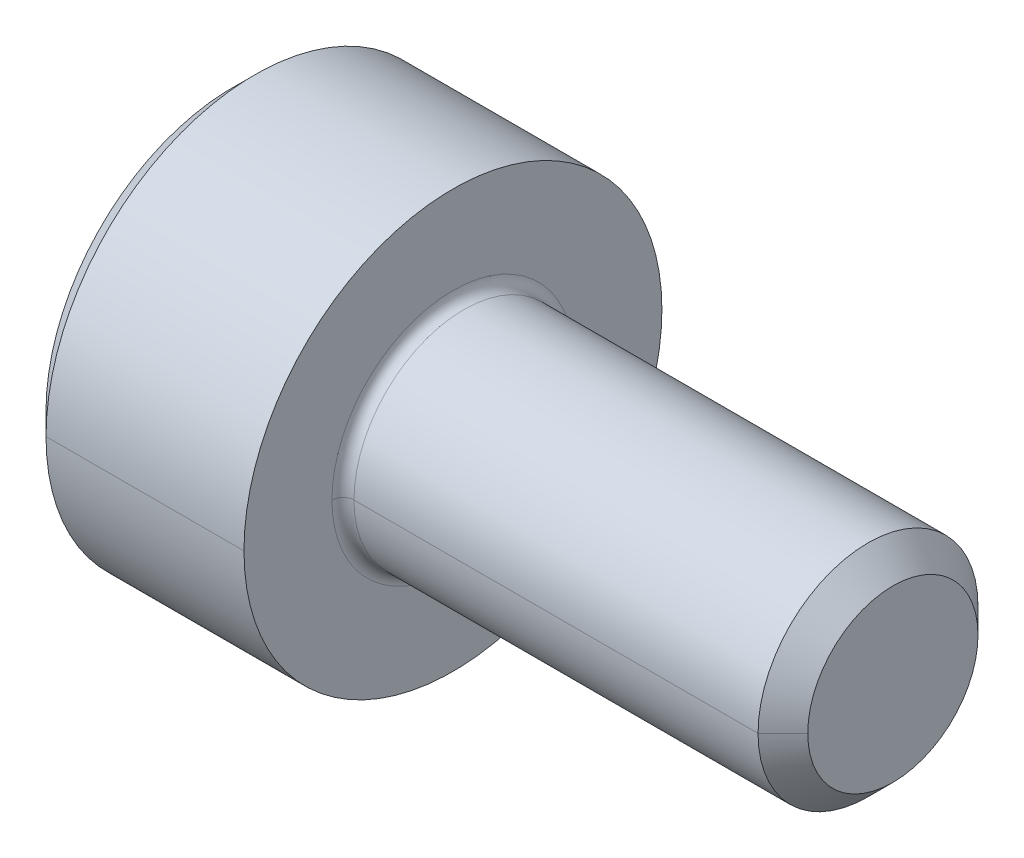
ISO-10303-21;
HEADER;
FILE_DESCRIPTION(('STEP AP214'),'2;1');
FILE_NAME('part.step','',(''),(''),'','','');
FILE_SCHEMA(('AUTOMOTIVE_DESIGN { 1 0 10303 214 1 1 1 1 }'));
ENDSEC;
DATA;
#1=APPLICATION_CONTEXT('core data for automotive mechanical design processes');
#2=APPLICATION_PROTOCOL_DEFINITION('international standard','automotive_design',2000,#1);
#3=PRODUCT_CONTEXT('',#1,'mechanical');
#4=PRODUCT('Part','Part','',(#3));
#5=PRODUCT_RELATED_PRODUCT_CATEGORY('part','',(#4));
#6=PRODUCT_DEFINITION_FORMATION('','',#4);
#7=PRODUCT_DEFINITION_CONTEXT('part definition',#1,'design');
#8=PRODUCT_DEFINITION('design','',#6,#7);
#9=PRODUCT_DEFINITION_SHAPE('','',#8);
#10=(LENGTH_UNIT() NAMED_UNIT(*) SI_UNIT(.MILLI.,.METRE.));
#11=(NAMED_UNIT(*) PLANE_ANGLE_UNIT() SI_UNIT($,.RADIAN.));
#12=(NAMED_UNIT(*) SI_UNIT($,.STERADIAN.) SOLID_ANGLE_UNIT());
#13=UNCERTAINTY_MEASURE_WITH_UNIT(LENGTH_MEASURE(1.E-05),#10,'distance_accuracy_value','');
#14=(GEOMETRIC_REPRESENTATION_CONTEXT(3) GLOBAL_UNCERTAINTY_ASSIGNED_CONTEXT((#13)) GLOBAL_UNIT_ASSIGNED_CONTEXT((#10,
#11,#12)) REPRESENTATION_CONTEXT('',''));
#15=CARTESIAN_POINT('',(0.,0.,0.));
#16=DIRECTION('',(0.,0.,1.));
#17=DIRECTION('',(1.,0.,0.));
#18=AXIS2_PLACEMENT_3D('',#15,#16,#17);
#19=CARTESIAN_POINT('',(1.,0.,0.));
#20=DIRECTION('',(-1.,0.,0.));
#21=DIRECTION('',(0.,0.,1.));
#22=AXIS2_PLACEMENT_3D('',#19,#20,#21);
#23=CONICAL_SURFACE('',#22,0.7725,1.04719755119659);
#24=DIRECTION('',(-0.500000000000007,0.,-0.866025403784435));
#25=VECTOR('',#24,1.);
#26=CARTESIAN_POINT('',(1.,0.,-0.7725));
#27=LINE('',#26,#25);
#28=CARTESIAN_POINT('',(1.446003082949,0.,0.));
#29=VERTEX_POINT('',#28);
#30=CARTESIAN_POINT('',(1.,0.,-0.7725));
#31=VERTEX_POINT('',#30);
#32=EDGE_CURVE('E162',#29,#31,#27,.T.);
#33=ORIENTED_EDGE('',*,*,#32,.F.);
#34=DIRECTION('',(-0.500000000000007,0.,0.866025403784435));
#35=VECTOR('',#34,1.);
#36=CARTESIAN_POINT('',(1.,0.,0.7725));
#37=LINE('',#36,#35);
#38=CARTESIAN_POINT('',(1.,0.,0.7725));
#39=VERTEX_POINT('',#38);
#40=EDGE_CURVE('E158',#29,#39,#37,.T.);
#41=ORIENTED_EDGE('',*,*,#40,.T.);
#42=CARTESIAN_POINT('',(1.,0.,0.));
#43=DIRECTION('',(-1.,0.,0.));
#44=DIRECTION('',(0.,0.,1.));
#45=AXIS2_PLACEMENT_3D('',#42,#43,#44);
#46=CIRCLE('',#45,0.7725);
#47=CARTESIAN_POINT('',(1.,0.669004624423476,0.38625));
#48=VERTEX_POINT('',#47);
#49=EDGE_CURVE('E253',#39,#48,#46,.T.);
#50=ORIENTED_EDGE('',*,*,#49,.T.);
#51=CARTESIAN_POINT('',(1.,0.,0.));
#52=DIRECTION('',(-1.,0.,0.));
#53=DIRECTION('',(0.,0.,1.));
#54=AXIS2_PLACEMENT_3D('',#51,#52,#53);
#55=CIRCLE('',#54,0.7725);
#56=CARTESIAN_POINT('',(1.,0.669004624423477,-0.38625));
#57=VERTEX_POINT('',#56);
#58=EDGE_CURVE('E28',#48,#57,#55,.T.);
#59=ORIENTED_EDGE('',*,*,#58,.T.);
#60=CARTESIAN_POINT('',(1.,0.,0.));
#61=DIRECTION('',(-1.,0.,0.));
#62=DIRECTION('',(0.,0.,1.));
#63=AXIS2_PLACEMENT_3D('',#60,#61,#62);
#64=CIRCLE('',#63,0.7725);
#65=EDGE_CURVE('E11',#57,#31,#64,.T.);
#66=ORIENTED_EDGE('',*,*,#65,.T.);
#67=EDGE_LOOP('',(#33,#41,#50,#59,#66));
#68=FACE_BOUND('',#67,.T.);
#69=ADVANCED_FACE('F17',(#68),#23,.F.);
#70=CARTESIAN_POINT('',(1.,1.33800924884695,-0.7725));
#71=DIRECTION('',(1.,0.,0.));
#72=DIRECTION('',(0.,1.,0.));
#73=AXIS2_PLACEMENT_3D('',#70,#71,#72);
#74=PLANE('',#73);
#75=DIRECTION('',(0.,-0.5,-0.866025403784438));
#76=VECTOR('',#75,1.);
#77=CARTESIAN_POINT('',(1.,0.892006165897968,0.));
#78=LINE('',#77,#76);
#79=CARTESIAN_POINT('',(1.,0.446003082948981,-0.7725));
#80=VERTEX_POINT('',#79);
#81=EDGE_CURVE('E21',#57,#80,#78,.T.);
#82=ORIENTED_EDGE('',*,*,#81,.T.);
#83=DIRECTION('',(0.,-1.,0.));
#84=VECTOR('',#83,1.);
#85=CARTESIAN_POINT('',(1.,0.446003082948981,-0.7725));
#86=LINE('',#85,#84);
#87=EDGE_CURVE('E121',#80,#31,#86,.T.);
#88=ORIENTED_EDGE('',*,*,#87,.T.);
#89=ORIENTED_EDGE('',*,*,#65,.F.);
#90=EDGE_LOOP('',(#82,#88,#89));
#91=FACE_BOUND('',#90,.T.);
#92=ADVANCED_FACE('F556',(#91),#74,.F.);
#93=CARTESIAN_POINT('',(1.,1.33800924884695,-0.7725));
#94=DIRECTION('',(1.,0.,0.));
#95=DIRECTION('',(0.,1.,0.));
#96=AXIS2_PLACEMENT_3D('',#93,#94,#95);
#97=PLANE('',#96);
#98=DIRECTION('',(0.,-0.5,0.86602540378444));
#99=VECTOR('',#98,1.);
#100=CARTESIAN_POINT('',(1.,0.892006165897968,0.));
#101=LINE('',#100,#99);
#102=CARTESIAN_POINT('',(1.,0.892006165897968,0.));
#103=VERTEX_POINT('',#102);
#104=EDGE_CURVE('E217',#103,#48,#101,.T.);
#105=ORIENTED_EDGE('',*,*,#104,.F.);
#106=DIRECTION('',(0.,-0.5,-0.866025403784438));
#107=VECTOR('',#106,1.);
#108=CARTESIAN_POINT('',(1.,0.892006165897968,0.));
#109=LINE('',#108,#107);
#110=EDGE_CURVE('E249',#103,#57,#109,.T.);
#111=ORIENTED_EDGE('',*,*,#110,.T.);
#112=ORIENTED_EDGE('',*,*,#58,.F.);
#113=EDGE_LOOP('',(#105,#111,#112));
#114=FACE_BOUND('',#113,.T.);
#115=ADVANCED_FACE('F750',(#114),#97,.F.);
#116=CARTESIAN_POINT('',(1.,1.33800924884695,-0.7725));
#117=DIRECTION('',(1.,0.,0.));
#118=DIRECTION('',(0.,1.,0.));
#119=AXIS2_PLACEMENT_3D('',#116,#117,#118);
#120=PLANE('',#119);
#121=DIRECTION('',(0.,1.,0.));
#122=VECTOR('',#121,1.);
#123=CARTESIAN_POINT('',(1.,-0.446003082948988,0.7725));
#124=LINE('',#123,#122);
#125=CARTESIAN_POINT('',(1.,0.446003082948983,0.7725));
#126=VERTEX_POINT('',#125);
#127=EDGE_CURVE('E156',#39,#126,#124,.T.);
#128=ORIENTED_EDGE('',*,*,#127,.T.);
#129=DIRECTION('',(0.,-0.5,0.86602540378444));
#130=VECTOR('',#129,1.);
#131=CARTESIAN_POINT('',(1.,0.892006165897968,0.));
#132=LINE('',#131,#130);
#133=EDGE_CURVE('E157',#48,#126,#132,.T.);
#134=ORIENTED_EDGE('',*,*,#133,.F.);
#135=ORIENTED_EDGE('',*,*,#49,.F.);
#136=EDGE_LOOP('',(#128,#134,#135));
#137=FACE_BOUND('',#136,.T.);
#138=ADVANCED_FACE('F739',(#137),#120,.F.);
#139=CARTESIAN_POINT('',(1.,1.33800924884695,-0.7725));
#140=DIRECTION('',(1.,0.,0.));
#141=DIRECTION('',(0.,1.,0.));
#142=AXIS2_PLACEMENT_3D('',#139,#140,#141);
#143=PLANE('',#142);
#144=DIRECTION('',(0.,-0.5,-0.866025403784438));
#145=VECTOR('',#144,1.);
#146=CARTESIAN_POINT('',(1.,-0.446003082948988,0.7725));
#147=LINE('',#146,#145);
#148=CARTESIAN_POINT('',(1.,-0.446003082948988,0.7725));
#149=VERTEX_POINT('',#148);
#150=CARTESIAN_POINT('',(1.,-0.66900462442348,0.38625));
#151=VERTEX_POINT('',#150);
#152=EDGE_CURVE('E184',#149,#151,#147,.T.);
#153=ORIENTED_EDGE('',*,*,#152,.F.);
#154=DIRECTION('',(0.,1.,0.));
#155=VECTOR('',#154,1.);
#156=CARTESIAN_POINT('',(1.,-0.446003082948988,0.7725));
#157=LINE('',#156,#155);
#158=EDGE_CURVE('E177',#149,#39,#157,.T.);
#159=ORIENTED_EDGE('',*,*,#158,.T.);
#160=CARTESIAN_POINT('',(1.,0.,0.));
#161=DIRECTION('',(-1.,0.,0.));
#162=DIRECTION('',(0.,0.,1.));
#163=AXIS2_PLACEMENT_3D('',#160,#161,#162);
#164=CIRCLE('',#163,0.7725);
#165=EDGE_CURVE('E228',#151,#39,#164,.T.);
#166=ORIENTED_EDGE('',*,*,#165,.F.);
#167=EDGE_LOOP('',(#153,#159,#166));
#168=FACE_BOUND('',#167,.T.);
#169=ADVANCED_FACE('F734',(#168),#143,.F.);
#170=CARTESIAN_POINT('',(1.,1.33800924884695,-0.7725));
#171=DIRECTION('',(1.,0.,0.));
#172=DIRECTION('',(0.,1.,0.));
#173=AXIS2_PLACEMENT_3D('',#170,#171,#172);
#174=PLANE('',#173);
#175=DIRECTION('',(0.,0.5,-0.86602540378444));
#176=VECTOR('',#175,1.);
#177=CARTESIAN_POINT('',(1.,-0.892006165897975,0.));
#178=LINE('',#177,#176);
#179=CARTESIAN_POINT('',(1.,-0.892006165897975,0.));
#180=VERTEX_POINT('',#179);
#181=CARTESIAN_POINT('',(1.,-0.669004624423483,-0.38625));
#182=VERTEX_POINT('',#181);
#183=EDGE_CURVE('E138',#180,#182,#178,.T.);
#184=ORIENTED_EDGE('',*,*,#183,.F.);
#185=DIRECTION('',(0.,-0.5,-0.866025403784438));
#186=VECTOR('',#185,1.);
#187=CARTESIAN_POINT('',(1.,-0.446003082948988,0.7725));
#188=LINE('',#187,#186);
#189=EDGE_CURVE('E188',#151,#180,#188,.T.);
#190=ORIENTED_EDGE('',*,*,#189,.F.);
#191=CARTESIAN_POINT('',(1.,0.,0.));
#192=DIRECTION('',(-1.,0.,0.));
#193=DIRECTION('',(0.,0.,1.));
#194=AXIS2_PLACEMENT_3D('',#191,#192,#193);
#195=CIRCLE('',#194,0.7725);
#196=EDGE_CURVE('E225',#182,#151,#195,.T.);
#197=ORIENTED_EDGE('',*,*,#196,.F.);
#198=EDGE_LOOP('',(#184,#190,#197));
#199=FACE_BOUND('',#198,.T.);
#200=ADVANCED_FACE('F719',(#199),#174,.F.);
#201=CARTESIAN_POINT('',(1.,1.33800924884695,-0.7725));
#202=DIRECTION('',(1.,0.,0.));
#203=DIRECTION('',(0.,1.,0.));
#204=AXIS2_PLACEMENT_3D('',#201,#202,#203);
#205=PLANE('',#204);
#206=DIRECTION('',(0.,-1.,0.));
#207=VECTOR('',#206,1.);
#208=CARTESIAN_POINT('',(1.,0.446003082948981,-0.7725));
#209=LINE('',#208,#207);
#210=CARTESIAN_POINT('',(1.,-0.44600308294899,-0.7725));
#211=VERTEX_POINT('',#210);
#212=EDGE_CURVE('E109',#31,#211,#209,.T.);
#213=ORIENTED_EDGE('',*,*,#212,.T.);
#214=DIRECTION('',(0.,0.5,-0.86602540378444));
#215=VECTOR('',#214,1.);
#216=CARTESIAN_POINT('',(1.,-0.892006165897975,0.));
#217=LINE('',#216,#215);
#218=EDGE_CURVE('E113',#182,#211,#217,.T.);
#219=ORIENTED_EDGE('',*,*,#218,.F.);
#220=CARTESIAN_POINT('',(1.,0.,0.));
#221=DIRECTION('',(-1.,0.,0.));
#222=DIRECTION('',(0.,0.,1.));
#223=AXIS2_PLACEMENT_3D('',#220,#221,#222);
#224=CIRCLE('',#223,0.7725);
#225=EDGE_CURVE('E116',#31,#182,#224,.T.);
#226=ORIENTED_EDGE('',*,*,#225,.F.);
#227=EDGE_LOOP('',(#213,#219,#226));
#228=FACE_BOUND('',#227,.T.);
#229=ADVANCED_FACE('F111',(#228),#205,.F.);
#230=CARTESIAN_POINT('',(1.,0.892006165897968,0.));
#231=DIRECTION('',(0.,0.866025403784438,-0.5));
#232=DIRECTION('',(-1.,0.,0.));
#233=AXIS2_PLACEMENT_3D('',#230,#231,#232);
#234=PLANE('',#233);
#235=DIRECTION('',(0.,-0.5,-0.866025403784438));
#236=VECTOR('',#235,1.);
#237=CARTESIAN_POINT('',(0.,0.892006165897968,0.));
#238=LINE('',#237,#236);
#239=CARTESIAN_POINT('',(0.,0.892006165897968,0.));
#240=VERTEX_POINT('',#239);
#241=CARTESIAN_POINT('',(0.,0.446003082948981,-0.7725));
#242=VERTEX_POINT('',#241);
#243=EDGE_CURVE('E194',#240,#242,#238,.T.);
#244=ORIENTED_EDGE('',*,*,#243,.T.);
#245=DIRECTION('',(-1.,0.,0.));
#246=VECTOR('',#245,1.);
#247=CARTESIAN_POINT('',(1.,0.446003082948981,-0.7725));
#248=LINE('',#247,#246);
#249=EDGE_CURVE('E261',#80,#242,#248,.T.);
#250=ORIENTED_EDGE('',*,*,#249,.F.);
#251=ORIENTED_EDGE('',*,*,#81,.F.);
#252=ORIENTED_EDGE('',*,*,#110,.F.);
#253=DIRECTION('',(-1.,0.,0.));
#254=VECTOR('',#253,1.);
#255=CARTESIAN_POINT('',(1.,0.892006165897968,0.));
#256=LINE('',#255,#254);
#257=EDGE_CURVE('E271',#103,#240,#256,.T.);
#258=ORIENTED_EDGE('',*,*,#257,.T.);
#259=EDGE_LOOP('',(#244,#250,#251,#252,#258));
#260=FACE_BOUND('',#259,.T.);
#261=ADVANCED_FACE('F539',(#260),#234,.F.);
#262=CARTESIAN_POINT('',(1.,0.446003082948981,-0.7725));
#263=DIRECTION('',(0.,0.,-1.));
#264=DIRECTION('',(0.,-1.,0.));
#265=AXIS2_PLACEMENT_3D('',#262,#263,#264);
#266=PLANE('',#265);
#267=DIRECTION('',(0.,-1.,0.));
#268=VECTOR('',#267,1.);
#269=CARTESIAN_POINT('',(0.,0.446003082948981,-0.7725));
#270=LINE('',#269,#268);
#271=CARTESIAN_POINT('',(0.,-0.44600308294899,-0.7725));
#272=VERTEX_POINT('',#271);
#273=EDGE_CURVE('E130',#242,#272,#270,.T.);
#274=ORIENTED_EDGE('',*,*,#273,.T.);
#275=DIRECTION('',(-1.,0.,0.));
#276=VECTOR('',#275,1.);
#277=CARTESIAN_POINT('',(1.,-0.44600308294899,-0.7725));
#278=LINE('',#277,#276);
#279=EDGE_CURVE('E122',#211,#272,#278,.T.);
#280=ORIENTED_EDGE('',*,*,#279,.F.);
#281=ORIENTED_EDGE('',*,*,#212,.F.);
#282=ORIENTED_EDGE('',*,*,#87,.F.);
#283=ORIENTED_EDGE('',*,*,#249,.T.);
#284=EDGE_LOOP('',(#274,#280,#281,#282,#283));
#285=FACE_BOUND('',#284,.T.);
#286=ADVANCED_FACE('F126',(#285),#266,.F.);
#287=CARTESIAN_POINT('',(1.,-0.892006165897975,0.));
#288=DIRECTION('',(0.,0.86602540378444,0.5));
#289=DIRECTION('',(1.,0.,0.));
#290=AXIS2_PLACEMENT_3D('',#287,#288,#289);
#291=PLANE('',#290);
#292=DIRECTION('',(0.,0.5,-0.86602540378444));
#293=VECTOR('',#292,1.);
#294=CARTESIAN_POINT('',(0.,-0.892006165897975,0.));
#295=LINE('',#294,#293);
#296=CARTESIAN_POINT('',(0.,-0.892006165897975,0.));
#297=VERTEX_POINT('',#296);
#298=EDGE_CURVE('E190',#297,#272,#295,.T.);
#299=ORIENTED_EDGE('',*,*,#298,.F.);
#300=DIRECTION('',(-1.,0.,0.));
#301=VECTOR('',#300,1.);
#302=CARTESIAN_POINT('',(1.,-0.892006165897975,0.));
#303=LINE('',#302,#301);
#304=EDGE_CURVE('E146',#180,#297,#303,.T.);
#305=ORIENTED_EDGE('',*,*,#304,.F.);
#306=ORIENTED_EDGE('',*,*,#183,.T.);
#307=ORIENTED_EDGE('',*,*,#218,.T.);
#308=ORIENTED_EDGE('',*,*,#279,.T.);
#309=EDGE_LOOP('',(#299,#305,#306,#307,#308));
#310=FACE_BOUND('',#309,.T.);
#311=ADVANCED_FACE('F136',(#310),#291,.T.);
#312=CARTESIAN_POINT('',(1.,-0.446003082948988,0.7725));
#313=DIRECTION('',(0.,0.866025403784438,-0.5));
#314=DIRECTION('',(-1.,0.,0.));
#315=AXIS2_PLACEMENT_3D('',#312,#313,#314);
#316=PLANE('',#315);
#317=DIRECTION('',(0.,-0.5,-0.866025403784438));
#318=VECTOR('',#317,1.);
#319=CARTESIAN_POINT('',(0.,-0.446003082948988,0.7725));
#320=LINE('',#319,#318);
#321=CARTESIAN_POINT('',(0.,-0.446003082948988,0.7725));
#322=VERTEX_POINT('',#321);
#323=EDGE_CURVE('E193',#322,#297,#320,.T.);
#324=ORIENTED_EDGE('',*,*,#323,.F.);
#325=DIRECTION('',(-1.,0.,0.));
#326=VECTOR('',#325,1.);
#327=CARTESIAN_POINT('',(1.,-0.446003082948988,0.7725));
#328=LINE('',#327,#326);
#329=EDGE_CURVE('E189',#149,#322,#328,.T.);
#330=ORIENTED_EDGE('',*,*,#329,.F.);
#331=ORIENTED_EDGE('',*,*,#152,.T.);
#332=ORIENTED_EDGE('',*,*,#189,.T.);
#333=ORIENTED_EDGE('',*,*,#304,.T.);
#334=EDGE_LOOP('',(#324,#330,#331,#332,#333));
#335=FACE_BOUND('',#334,.T.);
#336=ADVANCED_FACE('F530',(#335),#316,.T.);
#337=CARTESIAN_POINT('',(1.,-0.446003082948988,0.7725));
#338=DIRECTION('',(0.,0.,1.));
#339=DIRECTION('',(0.,-1.,0.));
#340=AXIS2_PLACEMENT_3D('',#337,#338,#339);
#341=PLANE('',#340);
#342=DIRECTION('',(0.,1.,0.));
#343=VECTOR('',#342,1.);
#344=CARTESIAN_POINT('',(0.,-0.446003082948988,0.7725));
#345=LINE('',#344,#343);
#346=CARTESIAN_POINT('',(0.,0.446003082948983,0.7725));
#347=VERTEX_POINT('',#346);
#348=EDGE_CURVE('E288',#322,#347,#345,.T.);
#349=ORIENTED_EDGE('',*,*,#348,.T.);
#350=DIRECTION('',(-1.,0.,0.));
#351=VECTOR('',#350,1.);
#352=CARTESIAN_POINT('',(1.,0.446003082948983,0.7725));
#353=LINE('',#352,#351);
#354=EDGE_CURVE('E152',#126,#347,#353,.T.);
#355=ORIENTED_EDGE('',*,*,#354,.F.);
#356=ORIENTED_EDGE('',*,*,#127,.F.);
#357=ORIENTED_EDGE('',*,*,#158,.F.);
#358=ORIENTED_EDGE('',*,*,#329,.T.);
#359=EDGE_LOOP('',(#349,#355,#356,#357,#358));
#360=FACE_BOUND('',#359,.T.);
#361=ADVANCED_FACE('F524',(#360),#341,.F.);
#362=CARTESIAN_POINT('',(1.,0.892006165897968,0.));
#363=DIRECTION('',(0.,-0.86602540378444,-0.5));
#364=DIRECTION('',(0.,0.5,-0.86602540378444));
#365=AXIS2_PLACEMENT_3D('',#362,#363,#364);
#366=PLANE('',#365);
#367=DIRECTION('',(0.,-0.5,0.86602540378444));
#368=VECTOR('',#367,1.);
#369=CARTESIAN_POINT('',(0.,0.892006165897968,0.));
#370=LINE('',#369,#368);
#371=EDGE_CURVE('E181',#240,#347,#370,.T.);
#372=ORIENTED_EDGE('',*,*,#371,.F.);
#373=ORIENTED_EDGE('',*,*,#257,.F.);
#374=ORIENTED_EDGE('',*,*,#104,.T.);
#375=ORIENTED_EDGE('',*,*,#133,.T.);
#376=ORIENTED_EDGE('',*,*,#354,.T.);
#377=EDGE_LOOP('',(#372,#373,#374,#375,#376));
#378=FACE_BOUND('',#377,.T.);
#379=ADVANCED_FACE('F529',(#378),#366,.T.);
#380=CARTESIAN_POINT('',(2.1,0.,0.));
#381=DIRECTION('',(1.,0.,0.));
#382=DIRECTION('',(0.,0.,-1.));
#383=AXIS2_PLACEMENT_3D('',#380,#381,#382);
#384=TOROIDAL_SURFACE('',#383,1.1,0.1);
#385=CARTESIAN_POINT('',(2.1,0.,1.1));
#386=DIRECTION('',(0.,1.,0.));
#387=DIRECTION('',(0.,0.,1.));
#388=AXIS2_PLACEMENT_3D('',#385,#386,#387);
#389=CIRCLE('',#388,0.1);
#390=CARTESIAN_POINT('',(2.1,0.,1.));
#391=VERTEX_POINT('',#390);
#392=CARTESIAN_POINT('',(2.,0.,1.1));
#393=VERTEX_POINT('',#392);
#394=EDGE_CURVE('E311',#391,#393,#389,.T.);
#395=ORIENTED_EDGE('',*,*,#394,.F.);
#396=CARTESIAN_POINT('',(2.1,0.,0.));
#397=DIRECTION('',(1.,0.,0.));
#398=DIRECTION('',(0.,0.,-1.));
#399=AXIS2_PLACEMENT_3D('',#396,#397,#398);
#400=CIRCLE('',#399,1.);
#401=CARTESIAN_POINT('',(2.1,0.,-1.));
#402=VERTEX_POINT('',#401);
#403=EDGE_CURVE('E270',#402,#391,#400,.T.);
#404=ORIENTED_EDGE('',*,*,#403,.F.);
#405=CARTESIAN_POINT('',(2.1,0.,-1.1));
#406=DIRECTION('',(0.,-1.,0.));
#407=DIRECTION('',(0.,0.,-1.));
#408=AXIS2_PLACEMENT_3D('',#405,#406,#407);
#409=CIRCLE('',#408,0.1);
#410=CARTESIAN_POINT('',(2.,0.,-1.1));
#411=VERTEX_POINT('',#410);
#412=EDGE_CURVE('E203',#402,#411,#409,.T.);
#413=ORIENTED_EDGE('',*,*,#412,.T.);
#414=CARTESIAN_POINT('',(2.,0.,0.));
#415=DIRECTION('',(-1.,0.,0.));
#416=DIRECTION('',(0.,0.,-1.));
#417=AXIS2_PLACEMENT_3D('',#414,#415,#416);
#418=CIRCLE('',#417,1.1);
#419=EDGE_CURVE('E256',#393,#411,#418,.T.);
#420=ORIENTED_EDGE('',*,*,#419,.F.);
#421=EDGE_LOOP('',(#395,#404,#413,#420));
#422=FACE_BOUND('',#421,.T.);
#423=ADVANCED_FACE('F593',(#422),#384,.F.);
#424=CARTESIAN_POINT('',(0.,0.,0.));
#425=DIRECTION('',(1.,0.,0.));
#426=DIRECTION('',(0.,0.,-1.));
#427=AXIS2_PLACEMENT_3D('',#424,#425,#426);
#428=CONICAL_SURFACE('',#427,1.7,0.785398163397449);
#429=DIRECTION('',(0.707106781186547,0.,0.707106781186548));
#430=VECTOR('',#429,1.);
#431=CARTESIAN_POINT('',(0.,0.,1.7));
#432=LINE('',#431,#430);
#433=CARTESIAN_POINT('',(0.,0.,1.7));
#434=VERTEX_POINT('',#433);
#435=CARTESIAN_POINT('',(0.2,0.,1.9));
#436=VERTEX_POINT('',#435);
#437=EDGE_CURVE('E202',#434,#436,#432,.T.);
#438=ORIENTED_EDGE('',*,*,#437,.F.);
#439=CARTESIAN_POINT('',(0.,0.,0.));
#440=DIRECTION('',(-1.,0.,0.));
#441=DIRECTION('',(0.,0.,1.));
#442=AXIS2_PLACEMENT_3D('',#439,#440,#441);
#443=CIRCLE('',#442,1.7);
#444=CARTESIAN_POINT('',(0.,0.,-1.7));
#445=VERTEX_POINT('',#444);
#446=EDGE_CURVE('E178',#445,#434,#443,.T.);
#447=ORIENTED_EDGE('',*,*,#446,.F.);
#448=DIRECTION('',(0.707106781186547,0.,-0.707106781186548));
#449=VECTOR('',#448,1.);
#450=CARTESIAN_POINT('',(0.,0.,-1.7));
#451=LINE('',#450,#449);
#452=CARTESIAN_POINT('',(0.2,0.,-1.9));
#453=VERTEX_POINT('',#452);
#454=EDGE_CURVE('E213',#445,#453,#451,.T.);
#455=ORIENTED_EDGE('',*,*,#454,.T.);
#456=CARTESIAN_POINT('',(0.2,0.,0.));
#457=DIRECTION('',(-1.,0.,0.));
#458=DIRECTION('',(0.,0.,1.));
#459=AXIS2_PLACEMENT_3D('',#456,#457,#458);
#460=CIRCLE('',#459,1.9);
#461=EDGE_CURVE('E260',#453,#436,#460,.T.);
#462=ORIENTED_EDGE('',*,*,#461,.T.);
#463=EDGE_LOOP('',(#438,#447,#455,#462));
#464=FACE_BOUND('',#463,.T.);
#465=ADVANCED_FACE('F570',(#464),#428,.T.);
#466=CARTESIAN_POINT('',(-31.75,0.,0.));
#467=DIRECTION('',(-1.,0.,0.));
#468=DIRECTION('',(0.,0.,1.));
#469=AXIS2_PLACEMENT_3D('',#466,#467,#468);
#470=CYLINDRICAL_SURFACE('',#469,1.9);
#471=DIRECTION('',(-1.,0.,0.));
#472=VECTOR('',#471,1.);
#473=CARTESIAN_POINT('',(-31.75,0.,-1.9));
#474=LINE('',#473,#472);
#475=CARTESIAN_POINT('',(2.,0.,-1.9));
#476=VERTEX_POINT('',#475);
#477=EDGE_CURVE('E169',#476,#453,#474,.T.);
#478=ORIENTED_EDGE('',*,*,#477,.F.);
#479=CARTESIAN_POINT('',(2.,0.,0.));
#480=DIRECTION('',(-1.,0.,0.));
#481=DIRECTION('',(0.,0.,1.));
#482=AXIS2_PLACEMENT_3D('',#479,#480,#481);
#483=CIRCLE('',#482,1.9);
#484=CARTESIAN_POINT('',(2.,0.,1.9));
#485=VERTEX_POINT('',#484);
#486=EDGE_CURVE('E167',#476,#485,#483,.T.);
#487=ORIENTED_EDGE('',*,*,#486,.T.);
#488=DIRECTION('',(-1.,0.,0.));
#489=VECTOR('',#488,1.);
#490=CARTESIAN_POINT('',(-31.75,0.,1.9));
#491=LINE('',#490,#489);
#492=EDGE_CURVE('E173',#485,#436,#491,.T.);
#493=ORIENTED_EDGE('',*,*,#492,.T.);
#494=ORIENTED_EDGE('',*,*,#461,.F.);
#495=EDGE_LOOP('',(#478,#487,#493,#494));
#496=FACE_BOUND('',#495,.T.);
#497=ADVANCED_FACE('F564',(#496),#470,.T.);
#498=CARTESIAN_POINT('',(2.,1.9,0.));
#499=DIRECTION('',(1.,0.,0.));
#500=DIRECTION('',(0.,1.,0.));
#501=AXIS2_PLACEMENT_3D('',#498,#499,#500);
#502=PLANE('',#501);
#503=CARTESIAN_POINT('',(2.,0.,0.));
#504=DIRECTION('',(-1.,0.,0.));
#505=DIRECTION('',(0.,0.,-1.));
#506=AXIS2_PLACEMENT_3D('',#503,#504,#505);
#507=CIRCLE('',#506,1.1);
#508=EDGE_CURVE('E244',#411,#393,#507,.T.);
#509=ORIENTED_EDGE('',*,*,#508,.T.);
#510=ORIENTED_EDGE('',*,*,#419,.T.);
#511=EDGE_LOOP('',(#509,#510));
#512=FACE_BOUND('',#511,.T.);
#513=CARTESIAN_POINT('',(2.,0.,0.));
#514=DIRECTION('',(-1.,0.,0.));
#515=DIRECTION('',(0.,0.,1.));
#516=AXIS2_PLACEMENT_3D('',#513,#514,#515);
#517=CIRCLE('',#516,1.9);
#518=EDGE_CURVE('E150',#485,#476,#517,.T.);
#519=ORIENTED_EDGE('',*,*,#518,.F.);
#520=ORIENTED_EDGE('',*,*,#486,.F.);
#521=EDGE_LOOP('',(#519,#520));
#522=FACE_BOUND('',#521,.T.);
#523=ADVANCED_FACE('F569',(#512,#522),#502,.T.);
#524=CARTESIAN_POINT('',(-31.75,0.,0.));
#525=DIRECTION('',(-1.,0.,0.));
#526=DIRECTION('',(0.,0.,1.));
#527=AXIS2_PLACEMENT_3D('',#524,#525,#526);
#528=CYLINDRICAL_SURFACE('',#527,1.);
#529=DIRECTION('',(-1.,0.,0.));
#530=VECTOR('',#529,1.);
#531=CARTESIAN_POINT('',(-31.75,0.,-1.));
#532=LINE('',#531,#530);
#533=CARTESIAN_POINT('',(5.774,0.,-1.));
#534=VERTEX_POINT('',#533);
#535=EDGE_CURVE('E222',#534,#402,#532,.T.);
#536=ORIENTED_EDGE('',*,*,#535,.F.);
#537=CARTESIAN_POINT('',(5.774,0.,0.));
#538=DIRECTION('',(-1.,0.,0.));
#539=DIRECTION('',(0.,0.,1.));
#540=AXIS2_PLACEMENT_3D('',#537,#538,#539);
#541=CIRCLE('',#540,1.);
#542=CARTESIAN_POINT('',(5.774,0.,1.));
#543=VERTEX_POINT('',#542);
#544=EDGE_CURVE('E163',#534,#543,#541,.T.);
#545=ORIENTED_EDGE('',*,*,#544,.T.);
#546=DIRECTION('',(-1.,0.,0.));
#547=VECTOR('',#546,1.);
#548=CARTESIAN_POINT('',(-31.75,0.,1.));
#549=LINE('',#548,#547);
#550=EDGE_CURVE('E266',#543,#391,#549,.T.);
#551=ORIENTED_EDGE('',*,*,#550,.T.);
#552=CARTESIAN_POINT('',(2.1,0.,0.));
#553=DIRECTION('',(1.,0.,0.));
#554=DIRECTION('',(0.,0.,-1.));
#555=AXIS2_PLACEMENT_3D('',#552,#553,#554);
#556=CIRCLE('',#555,1.);
#557=EDGE_CURVE('E235',#391,#402,#556,.T.);
#558=ORIENTED_EDGE('',*,*,#557,.T.);
#559=EDGE_LOOP('',(#536,#545,#551,#558));
#560=FACE_BOUND('',#559,.T.);
#561=ADVANCED_FACE('F582',(#560),#528,.T.);
#562=CARTESIAN_POINT('',(6.,0.,0.));
#563=DIRECTION('',(-1.,0.,0.));
#564=DIRECTION('',(0.,0.,1.));
#565=AXIS2_PLACEMENT_3D('',#562,#563,#564);
#566=CONICAL_SURFACE('',#565,0.774,0.785398163397471);
#567=DIRECTION('',(-0.707106781186531,0.,-0.707106781186564));
#568=VECTOR('',#567,1.);
#569=CARTESIAN_POINT('',(6.,0.,-0.774));
#570=LINE('',#569,#568);
#571=CARTESIAN_POINT('',(6.,0.,-0.774));
#572=VERTEX_POINT('',#571);
#573=EDGE_CURVE('E204',#572,#534,#570,.T.);
#574=ORIENTED_EDGE('',*,*,#573,.F.);
#575=CARTESIAN_POINT('',(6.,0.,0.));
#576=DIRECTION('',(-1.,0.,0.));
#577=DIRECTION('',(0.,0.,1.));
#578=AXIS2_PLACEMENT_3D('',#575,#576,#577);
#579=CIRCLE('',#578,0.774);
#580=CARTESIAN_POINT('',(6.,0.,0.774));
#581=VERTEX_POINT('',#580);
#582=EDGE_CURVE('E168',#572,#581,#579,.T.);
#583=ORIENTED_EDGE('',*,*,#582,.T.);
#584=DIRECTION('',(-0.707106781186531,0.,0.707106781186564));
#585=VECTOR('',#584,1.);
#586=CARTESIAN_POINT('',(6.,0.,0.774));
#587=LINE('',#586,#585);
#588=EDGE_CURVE('E182',#581,#543,#587,.T.);
#589=ORIENTED_EDGE('',*,*,#588,.T.);
#590=ORIENTED_EDGE('',*,*,#544,.F.);
#591=EDGE_LOOP('',(#574,#583,#589,#590));
#592=FACE_BOUND('',#591,.T.);
#593=ADVANCED_FACE('F616',(#592),#566,.T.);
#594=CARTESIAN_POINT('',(6.,0.774,0.));
#595=DIRECTION('',(1.,0.,0.));
#596=DIRECTION('',(0.,1.,0.));
#597=AXIS2_PLACEMENT_3D('',#594,#595,#596);
#598=PLANE('',#597);
#599=CARTESIAN_POINT('',(6.,0.,0.));
#600=DIRECTION('',(-1.,0.,0.));
#601=DIRECTION('',(0.,0.,1.));
#602=AXIS2_PLACEMENT_3D('',#599,#600,#601);
#603=CIRCLE('',#602,0.774);
#604=EDGE_CURVE('E208',#581,#572,#603,.T.);
#605=ORIENTED_EDGE('',*,*,#604,.F.);
#606=ORIENTED_EDGE('',*,*,#582,.F.);
#607=EDGE_LOOP('',(#605,#606));
#608=FACE_BOUND('',#607,.T.);
#609=ADVANCED_FACE('F621',(#608),#598,.T.);
#610=CARTESIAN_POINT('',(0.,0.,0.));
#611=DIRECTION('',(-1.,0.,0.));
#612=DIRECTION('',(0.,0.,1.));
#613=AXIS2_PLACEMENT_3D('',#610,#611,#612);
#614=PLANE('',#613);
#615=ORIENTED_EDGE('',*,*,#371,.T.);
#616=ORIENTED_EDGE('',*,*,#348,.F.);
#617=ORIENTED_EDGE('',*,*,#323,.T.);
#618=ORIENTED_EDGE('',*,*,#298,.T.);
#619=ORIENTED_EDGE('',*,*,#273,.F.);
#620=ORIENTED_EDGE('',*,*,#243,.F.);
#621=EDGE_LOOP('',(#615,#616,#617,#618,#619,#620));
#622=FACE_BOUND('',#621,.T.);
#623=ORIENTED_EDGE('',*,*,#446,.T.);
#624=CARTESIAN_POINT('',(0.,0.,0.));
#625=DIRECTION('',(-1.,0.,0.));
#626=DIRECTION('',(0.,0.,1.));
#627=AXIS2_PLACEMENT_3D('',#624,#625,#626);
#628=CIRCLE('',#627,1.7);
#629=EDGE_CURVE('E198',#434,#445,#628,.T.);
#630=ORIENTED_EDGE('',*,*,#629,.T.);
#631=EDGE_LOOP('',(#623,#630));
#632=FACE_BOUND('',#631,.T.);
#633=ADVANCED_FACE('F607',(#622,#632),#614,.T.);
#634=CARTESIAN_POINT('',(6.,0.,0.));
#635=DIRECTION('',(-1.,0.,0.));
#636=DIRECTION('',(0.,0.,1.));
#637=AXIS2_PLACEMENT_3D('',#634,#635,#636);
#638=CONICAL_SURFACE('',#637,0.774,0.785398163397471);
#639=ORIENTED_EDGE('',*,*,#604,.T.);
#640=ORIENTED_EDGE('',*,*,#573,.T.);
#641=CARTESIAN_POINT('',(5.774,0.,0.));
#642=DIRECTION('',(-1.,0.,0.));
#643=DIRECTION('',(0.,0.,1.));
#644=AXIS2_PLACEMENT_3D('',#641,#642,#643);
#645=CIRCLE('',#644,1.);
#646=EDGE_CURVE('E218',#543,#534,#645,.T.);
#647=ORIENTED_EDGE('',*,*,#646,.F.);
#648=ORIENTED_EDGE('',*,*,#588,.F.);
#649=EDGE_LOOP('',(#639,#640,#647,#648));
#650=FACE_BOUND('',#649,.T.);
#651=ADVANCED_FACE('F601',(#650),#638,.T.);
#652=CARTESIAN_POINT('',(-31.75,0.,0.));
#653=DIRECTION('',(-1.,0.,0.));
#654=DIRECTION('',(0.,0.,1.));
#655=AXIS2_PLACEMENT_3D('',#652,#653,#654);
#656=CYLINDRICAL_SURFACE('',#655,1.);
#657=ORIENTED_EDGE('',*,*,#646,.T.);
#658=ORIENTED_EDGE('',*,*,#535,.T.);
#659=ORIENTED_EDGE('',*,*,#403,.T.);
#660=ORIENTED_EDGE('',*,*,#550,.F.);
#661=EDGE_LOOP('',(#657,#658,#659,#660));
#662=FACE_BOUND('',#661,.T.);
#663=ADVANCED_FACE('F606',(#662),#656,.T.);
#664=CARTESIAN_POINT('',(-31.75,0.,0.));
#665=DIRECTION('',(-1.,0.,0.));
#666=DIRECTION('',(0.,0.,1.));
#667=AXIS2_PLACEMENT_3D('',#664,#665,#666);
#668=CYLINDRICAL_SURFACE('',#667,1.9);
#669=ORIENTED_EDGE('',*,*,#518,.T.);
#670=ORIENTED_EDGE('',*,*,#477,.T.);
#671=CARTESIAN_POINT('',(0.2,0.,0.));
#672=DIRECTION('',(-1.,0.,0.));
#673=DIRECTION('',(0.,0.,1.));
#674=AXIS2_PLACEMENT_3D('',#671,#672,#673);
#675=CIRCLE('',#674,1.9);
#676=EDGE_CURVE('E209',#436,#453,#675,.T.);
#677=ORIENTED_EDGE('',*,*,#676,.F.);
#678=ORIENTED_EDGE('',*,*,#492,.F.);
#679=EDGE_LOOP('',(#669,#670,#677,#678));
#680=FACE_BOUND('',#679,.T.);
#681=ADVANCED_FACE('F642',(#680),#668,.T.);
#682=CARTESIAN_POINT('',(0.,0.,0.));
#683=DIRECTION('',(1.,0.,0.));
#684=DIRECTION('',(0.,0.,-1.));
#685=AXIS2_PLACEMENT_3D('',#682,#683,#684);
#686=CONICAL_SURFACE('',#685,1.7,0.785398163397449);
#687=ORIENTED_EDGE('',*,*,#629,.F.);
#688=ORIENTED_EDGE('',*,*,#437,.T.);
#689=ORIENTED_EDGE('',*,*,#676,.T.);
#690=ORIENTED_EDGE('',*,*,#454,.F.);
#691=EDGE_LOOP('',(#687,#688,#689,#690));
#692=FACE_BOUND('',#691,.T.);
#693=ADVANCED_FACE('F682',(#692),#686,.T.);
#694=CARTESIAN_POINT('',(2.1,0.,0.));
#695=DIRECTION('',(1.,0.,0.));
#696=DIRECTION('',(0.,0.,-1.));
#697=AXIS2_PLACEMENT_3D('',#694,#695,#696);
#698=TOROIDAL_SURFACE('',#697,1.1,0.1);
#699=ORIENTED_EDGE('',*,*,#557,.F.);
#700=ORIENTED_EDGE('',*,*,#394,.T.);
#701=ORIENTED_EDGE('',*,*,#508,.F.);
#702=ORIENTED_EDGE('',*,*,#412,.F.);
#703=EDGE_LOOP('',(#699,#700,#701,#702));
#704=FACE_BOUND('',#703,.T.);
#705=ADVANCED_FACE('F19',(#704),#698,.F.);
#706=CARTESIAN_POINT('',(1.,0.,0.));
#707=DIRECTION('',(-1.,0.,0.));
#708=DIRECTION('',(0.,0.,1.));
#709=AXIS2_PLACEMENT_3D('',#706,#707,#708);
#710=CONICAL_SURFACE('',#709,0.7725,1.04719755119659);
#711=ORIENTED_EDGE('',*,*,#40,.F.);
#712=ORIENTED_EDGE('',*,*,#32,.T.);
#713=ORIENTED_EDGE('',*,*,#225,.T.);
#714=ORIENTED_EDGE('',*,*,#196,.T.);
#715=ORIENTED_EDGE('',*,*,#165,.T.);
#716=EDGE_LOOP('',(#711,#712,#713,#714,#715));
#717=FACE_BOUND('',#716,.T.);
#718=ADVANCED_FACE('F650',(#717),#710,.F.);
#719=CLOSED_SHELL('',(#69,#92,#115,#138,#169,#200,#229,#261,#286,#311,#336,#361,#379,#423,#465,
#497,#523,#561,#593,#609,#633,#651,#663,#681,#693,#705,#718));
#720=MANIFOLD_SOLID_BREP('B1',#719);
#721=ADVANCED_BREP_SHAPE_REPRESENTATION('',(#18,#720),#14);
#722=SHAPE_DEFINITION_REPRESENTATION(#9,#721);
ENDSEC;
END-ISO-10303-21;
